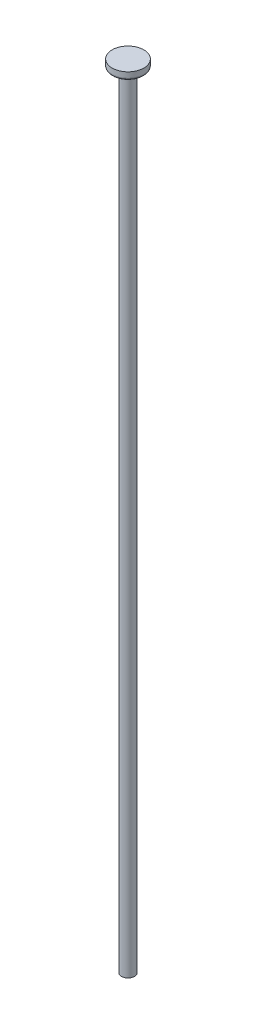
ISO-10303-21;
HEADER;
FILE_DESCRIPTION(('STEP AP214'),'2;1');
FILE_NAME('part.step','',(''),(''),'','','');
FILE_SCHEMA(('AUTOMOTIVE_DESIGN { 1 0 10303 214 1 1 1 1 }'));
ENDSEC;
DATA;
#1=APPLICATION_CONTEXT('core data for automotive mechanical design processes');
#2=APPLICATION_PROTOCOL_DEFINITION('international standard','automotive_design',2000,#1);
#3=PRODUCT_CONTEXT('',#1,'mechanical');
#4=PRODUCT('Part','Part','',(#3));
#5=PRODUCT_RELATED_PRODUCT_CATEGORY('part','',(#4));
#6=PRODUCT_DEFINITION_FORMATION('','',#4);
#7=PRODUCT_DEFINITION_CONTEXT('part definition',#1,'design');
#8=PRODUCT_DEFINITION('design','',#6,#7);
#9=PRODUCT_DEFINITION_SHAPE('','',#8);
#10=(LENGTH_UNIT() NAMED_UNIT(*) SI_UNIT(.MILLI.,.METRE.));
#11=(NAMED_UNIT(*) PLANE_ANGLE_UNIT() SI_UNIT($,.RADIAN.));
#12=(NAMED_UNIT(*) SI_UNIT($,.STERADIAN.) SOLID_ANGLE_UNIT());
#13=UNCERTAINTY_MEASURE_WITH_UNIT(LENGTH_MEASURE(1.E-05),#10,'distance_accuracy_value','');
#14=(GEOMETRIC_REPRESENTATION_CONTEXT(3) GLOBAL_UNCERTAINTY_ASSIGNED_CONTEXT((#13)) GLOBAL_UNIT_ASSIGNED_CONTEXT((#10,
#11,#12)) REPRESENTATION_CONTEXT('',''));
#15=CARTESIAN_POINT('',(0.,0.,0.));
#16=DIRECTION('',(0.,0.,1.));
#17=DIRECTION('',(1.,0.,0.));
#18=AXIS2_PLACEMENT_3D('',#15,#16,#17);
#19=CARTESIAN_POINT('',(0.,107.95,0.));
#20=DIRECTION('',(0.,-1.,0.));
#21=DIRECTION('',(0.,0.,-1.));
#22=AXIS2_PLACEMENT_3D('',#19,#20,#21);
#23=CYLINDRICAL_SURFACE('',#22,0.889);
#24=CARTESIAN_POINT('',(0.,0.,0.));
#25=DIRECTION('',(0.,1.,0.));
#26=DIRECTION('',(0.,0.,1.));
#27=AXIS2_PLACEMENT_3D('',#24,#25,#26);
#28=CIRCLE('',#27,0.889);
#29=CARTESIAN_POINT('',(0.,0.,0.889));
#30=VERTEX_POINT('',#29);
#31=EDGE_CURVE('E59',#30,#30,#28,.T.);
#32=ORIENTED_EDGE('',*,*,#31,.T.);
#33=EDGE_LOOP('',(#32));
#34=FACE_BOUND('',#33,.T.);
#35=CARTESIAN_POINT('',(0.,106.934,0.));
#36=DIRECTION('',(0.,1.,0.));
#37=DIRECTION('',(0.,0.,1.));
#38=AXIS2_PLACEMENT_3D('',#35,#36,#37);
#39=CIRCLE('',#38,0.889);
#40=CARTESIAN_POINT('',(0.,106.934,0.889));
#41=VERTEX_POINT('',#40);
#42=EDGE_CURVE('E53',#41,#41,#39,.T.);
#43=ORIENTED_EDGE('',*,*,#42,.F.);
#44=EDGE_LOOP('',(#43));
#45=FACE_BOUND('',#44,.T.);
#46=ADVANCED_FACE('F39',(#34,#45),#23,.T.);
#47=CARTESIAN_POINT('',(0.,0.,0.));
#48=DIRECTION('',(0.,1.,0.));
#49=DIRECTION('',(0.,0.,1.));
#50=AXIS2_PLACEMENT_3D('',#47,#48,#49);
#51=PLANE('',#50);
#52=ORIENTED_EDGE('',*,*,#31,.F.);
#53=EDGE_LOOP('',(#52));
#54=FACE_BOUND('',#53,.T.);
#55=ADVANCED_FACE('F76',(#54),#51,.F.);
#56=CARTESIAN_POINT('',(0.,106.934,0.));
#57=DIRECTION('',(0.,1.,0.));
#58=DIRECTION('',(0.,0.,1.));
#59=AXIS2_PLACEMENT_3D('',#56,#57,#58);
#60=CYLINDRICAL_SURFACE('',#59,2.159);
#61=CARTESIAN_POINT('',(0.,107.188,0.));
#62=DIRECTION('',(0.,1.,0.));
#63=DIRECTION('',(0.,0.,1.));
#64=AXIS2_PLACEMENT_3D('',#61,#62,#63);
#65=CIRCLE('',#64,2.159);
#66=CARTESIAN_POINT('',(0.,107.188,2.159));
#67=VERTEX_POINT('',#66);
#68=EDGE_CURVE('E47',#67,#67,#65,.T.);
#69=ORIENTED_EDGE('',*,*,#68,.T.);
#70=EDGE_LOOP('',(#69));
#71=FACE_BOUND('',#70,.T.);
#72=CARTESIAN_POINT('',(0.,107.95,0.));
#73=DIRECTION('',(0.,1.,0.));
#74=DIRECTION('',(0.,0.,1.));
#75=AXIS2_PLACEMENT_3D('',#72,#73,#74);
#76=CIRCLE('',#75,2.159);
#77=CARTESIAN_POINT('',(0.,107.95,2.159));
#78=VERTEX_POINT('',#77);
#79=EDGE_CURVE('E65',#78,#78,#76,.T.);
#80=ORIENTED_EDGE('',*,*,#79,.F.);
#81=EDGE_LOOP('',(#80));
#82=FACE_BOUND('',#81,.T.);
#83=ADVANCED_FACE('F73',(#71,#82),#60,.T.);
#84=CARTESIAN_POINT('',(0.,106.934,0.));
#85=DIRECTION('',(0.,1.,0.));
#86=DIRECTION('',(0.,0.,1.));
#87=AXIS2_PLACEMENT_3D('',#84,#85,#86);
#88=PLANE('',#87);
#89=CARTESIAN_POINT('',(0.,106.934,0.));
#90=DIRECTION('',(0.,1.,0.));
#91=DIRECTION('',(0.,0.,1.));
#92=AXIS2_PLACEMENT_3D('',#89,#90,#91);
#93=CIRCLE('',#92,1.905);
#94=CARTESIAN_POINT('',(0.,106.934,1.905));
#95=VERTEX_POINT('',#94);
#96=EDGE_CURVE('E10',#95,#95,#93,.F.);
#97=ORIENTED_EDGE('',*,*,#96,.T.);
#98=EDGE_LOOP('',(#97));
#99=FACE_BOUND('',#98,.T.);
#100=ORIENTED_EDGE('',*,*,#42,.T.);
#101=EDGE_LOOP('',(#100));
#102=FACE_BOUND('',#101,.T.);
#103=ADVANCED_FACE('F75',(#99,#102),#88,.F.);
#104=CARTESIAN_POINT('',(0.,107.95,0.));
#105=DIRECTION('',(0.,1.,0.));
#106=DIRECTION('',(0.,0.,1.));
#107=AXIS2_PLACEMENT_3D('',#104,#105,#106);
#108=PLANE('',#107);
#109=ORIENTED_EDGE('',*,*,#79,.T.);
#110=EDGE_LOOP('',(#109));
#111=FACE_BOUND('',#110,.T.);
#112=ADVANCED_FACE('F71',(#111),#108,.T.);
#113=CARTESIAN_POINT('',(0.,107.188,0.));
#114=DIRECTION('',(0.,1.,0.));
#115=DIRECTION('',(0.,0.,1.));
#116=AXIS2_PLACEMENT_3D('',#113,#114,#115);
#117=TOROIDAL_SURFACE('',#116,1.905,0.254);
#118=ORIENTED_EDGE('',*,*,#96,.F.);
#119=EDGE_LOOP('',(#118));
#120=FACE_BOUND('',#119,.T.);
#121=ORIENTED_EDGE('',*,*,#68,.F.);
#122=EDGE_LOOP('',(#121));
#123=FACE_BOUND('',#122,.T.);
#124=ADVANCED_FACE('F41',(#120,#123),#117,.T.);
#125=CLOSED_SHELL('',(#46,#55,#83,#103,#112,#124));
#126=MANIFOLD_SOLID_BREP('B2',#125);
#127=ADVANCED_BREP_SHAPE_REPRESENTATION('',(#18,#126),#14);
#128=SHAPE_DEFINITION_REPRESENTATION(#9,#127);
ENDSEC;
END-ISO-10303-21;
